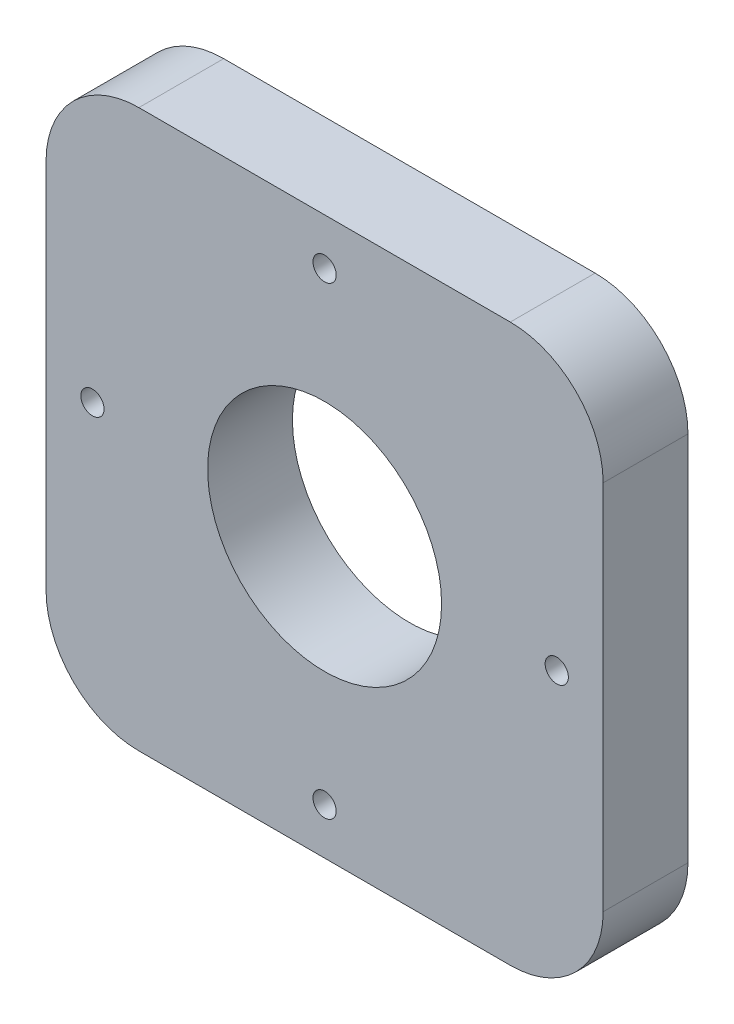
ISO-10303-21;
HEADER;
FILE_DESCRIPTION(('STEP AP214'),'2;1');
FILE_NAME('part.step','',(''),(''),'','','');
FILE_SCHEMA(('AUTOMOTIVE_DESIGN { 1 0 10303 214 1 1 1 1 }'));
ENDSEC;
DATA;
#1=APPLICATION_CONTEXT('core data for automotive mechanical design processes');
#2=APPLICATION_PROTOCOL_DEFINITION('international standard','automotive_design',2000,#1);
#3=PRODUCT_CONTEXT('',#1,'mechanical');
#4=PRODUCT('Part','Part','',(#3));
#5=PRODUCT_RELATED_PRODUCT_CATEGORY('part','',(#4));
#6=PRODUCT_DEFINITION_FORMATION('','',#4);
#7=PRODUCT_DEFINITION_CONTEXT('part definition',#1,'design');
#8=PRODUCT_DEFINITION('design','',#6,#7);
#9=PRODUCT_DEFINITION_SHAPE('','',#8);
#10=(LENGTH_UNIT() NAMED_UNIT(*) SI_UNIT(.MILLI.,.METRE.));
#11=(NAMED_UNIT(*) PLANE_ANGLE_UNIT() SI_UNIT($,.RADIAN.));
#12=(NAMED_UNIT(*) SI_UNIT($,.STERADIAN.) SOLID_ANGLE_UNIT());
#13=UNCERTAINTY_MEASURE_WITH_UNIT(LENGTH_MEASURE(1.E-05),#10,'distance_accuracy_value','');
#14=(GEOMETRIC_REPRESENTATION_CONTEXT(3) GLOBAL_UNCERTAINTY_ASSIGNED_CONTEXT((#13)) GLOBAL_UNIT_ASSIGNED_CONTEXT((#10,
#11,#12)) REPRESENTATION_CONTEXT('',''));
#15=CARTESIAN_POINT('',(0.,0.,0.));
#16=DIRECTION('',(0.,0.,1.));
#17=DIRECTION('',(1.,0.,0.));
#18=AXIS2_PLACEMENT_3D('',#15,#16,#17);
#19=CARTESIAN_POINT('',(19.05,19.05,5.8));
#20=DIRECTION('',(-1.,0.,0.));
#21=DIRECTION('',(0.,0.,1.));
#22=AXIS2_PLACEMENT_3D('',#19,#20,#21);
#23=PLANE('',#22);
#24=DIRECTION('',(0.,1.,0.));
#25=VECTOR('',#24,1.);
#26=CARTESIAN_POINT('',(19.05,19.05,0.));
#27=LINE('',#26,#25);
#28=CARTESIAN_POINT('',(19.05,-12.7,0.));
#29=VERTEX_POINT('',#28);
#30=CARTESIAN_POINT('',(19.05,12.7,0.));
#31=VERTEX_POINT('',#30);
#32=EDGE_CURVE('E125',#29,#31,#27,.T.);
#33=ORIENTED_EDGE('',*,*,#32,.T.);
#34=DIRECTION('',(0.,0.,-1.));
#35=VECTOR('',#34,1.);
#36=CARTESIAN_POINT('',(19.05,12.7,5.8));
#37=LINE('',#36,#35);
#38=CARTESIAN_POINT('',(19.05,12.7,5.8));
#39=VERTEX_POINT('',#38);
#40=EDGE_CURVE('E103',#31,#39,#37,.F.);
#41=ORIENTED_EDGE('',*,*,#40,.T.);
#42=DIRECTION('',(0.,1.,0.));
#43=VECTOR('',#42,1.);
#44=CARTESIAN_POINT('',(19.05,19.05,5.8));
#45=LINE('',#44,#43);
#46=CARTESIAN_POINT('',(19.05,-12.7,5.8));
#47=VERTEX_POINT('',#46);
#48=EDGE_CURVE('E135',#47,#39,#45,.T.);
#49=ORIENTED_EDGE('',*,*,#48,.F.);
#50=DIRECTION('',(0.,0.,-1.));
#51=VECTOR('',#50,1.);
#52=CARTESIAN_POINT('',(19.05,-12.7,5.8));
#53=LINE('',#52,#51);
#54=EDGE_CURVE('E108',#47,#29,#53,.T.);
#55=ORIENTED_EDGE('',*,*,#54,.T.);
#56=EDGE_LOOP('',(#33,#41,#49,#55));
#57=FACE_BOUND('',#56,.T.);
#58=ADVANCED_FACE('F32',(#57),#23,.F.);
#59=CARTESIAN_POINT('',(19.05,19.05,5.8));
#60=DIRECTION('',(0.,-1.,0.));
#61=DIRECTION('',(0.,0.,-1.));
#62=AXIS2_PLACEMENT_3D('',#59,#60,#61);
#63=PLANE('',#62);
#64=DIRECTION('',(-1.,0.,0.));
#65=VECTOR('',#64,1.);
#66=CARTESIAN_POINT('',(19.05,19.05,5.8));
#67=LINE('',#66,#65);
#68=CARTESIAN_POINT('',(12.7,19.05,5.8));
#69=VERTEX_POINT('',#68);
#70=CARTESIAN_POINT('',(-12.7,19.05,5.8));
#71=VERTEX_POINT('',#70);
#72=EDGE_CURVE('E118',#69,#71,#67,.T.);
#73=ORIENTED_EDGE('',*,*,#72,.F.);
#74=DIRECTION('',(0.,0.,-1.));
#75=VECTOR('',#74,1.);
#76=CARTESIAN_POINT('',(12.7,19.05,5.8));
#77=LINE('',#76,#75);
#78=CARTESIAN_POINT('',(12.7,19.05,0.));
#79=VERTEX_POINT('',#78);
#80=EDGE_CURVE('E102',#69,#79,#77,.T.);
#81=ORIENTED_EDGE('',*,*,#80,.T.);
#82=DIRECTION('',(-1.,0.,0.));
#83=VECTOR('',#82,1.);
#84=CARTESIAN_POINT('',(19.05,19.05,0.));
#85=LINE('',#84,#83);
#86=CARTESIAN_POINT('',(-12.7,19.05,0.));
#87=VERTEX_POINT('',#86);
#88=EDGE_CURVE('E115',#79,#87,#85,.T.);
#89=ORIENTED_EDGE('',*,*,#88,.T.);
#90=DIRECTION('',(0.,0.,-1.));
#91=VECTOR('',#90,1.);
#92=CARTESIAN_POINT('',(-12.7,19.05,5.8));
#93=LINE('',#92,#91);
#94=EDGE_CURVE('E120',#87,#71,#93,.F.);
#95=ORIENTED_EDGE('',*,*,#94,.T.);
#96=EDGE_LOOP('',(#73,#81,#89,#95));
#97=FACE_BOUND('',#96,.T.);
#98=ADVANCED_FACE('F114',(#97),#63,.F.);
#99=CARTESIAN_POINT('',(-19.05,19.05,5.8));
#100=DIRECTION('',(1.,0.,0.));
#101=DIRECTION('',(0.,0.,-1.));
#102=AXIS2_PLACEMENT_3D('',#99,#100,#101);
#103=PLANE('',#102);
#104=DIRECTION('',(0.,-1.,0.));
#105=VECTOR('',#104,1.);
#106=CARTESIAN_POINT('',(-19.05,19.05,5.8));
#107=LINE('',#106,#105);
#108=CARTESIAN_POINT('',(-19.05,12.7,5.8));
#109=VERTEX_POINT('',#108);
#110=CARTESIAN_POINT('',(-19.05,-12.7,5.8));
#111=VERTEX_POINT('',#110);
#112=EDGE_CURVE('E166',#109,#111,#107,.T.);
#113=ORIENTED_EDGE('',*,*,#112,.F.);
#114=DIRECTION('',(0.,0.,-1.));
#115=VECTOR('',#114,1.);
#116=CARTESIAN_POINT('',(-19.05,12.7,5.8));
#117=LINE('',#116,#115);
#118=CARTESIAN_POINT('',(-19.05,12.7,0.));
#119=VERTEX_POINT('',#118);
#120=EDGE_CURVE('E159',#109,#119,#117,.T.);
#121=ORIENTED_EDGE('',*,*,#120,.T.);
#122=DIRECTION('',(0.,-1.,0.));
#123=VECTOR('',#122,1.);
#124=CARTESIAN_POINT('',(-19.05,19.05,0.));
#125=LINE('',#124,#123);
#126=CARTESIAN_POINT('',(-19.05,-12.7,0.));
#127=VERTEX_POINT('',#126);
#128=EDGE_CURVE('E124',#119,#127,#125,.T.);
#129=ORIENTED_EDGE('',*,*,#128,.T.);
#130=DIRECTION('',(0.,0.,-1.));
#131=VECTOR('',#130,1.);
#132=CARTESIAN_POINT('',(-19.05,-12.7,5.8));
#133=LINE('',#132,#131);
#134=EDGE_CURVE('E157',#127,#111,#133,.F.);
#135=ORIENTED_EDGE('',*,*,#134,.T.);
#136=EDGE_LOOP('',(#113,#121,#129,#135));
#137=FACE_BOUND('',#136,.T.);
#138=ADVANCED_FACE('F164',(#137),#103,.F.);
#139=CARTESIAN_POINT('',(19.05,-19.05,5.8));
#140=DIRECTION('',(0.,1.,0.));
#141=DIRECTION('',(0.,0.,1.));
#142=AXIS2_PLACEMENT_3D('',#139,#140,#141);
#143=PLANE('',#142);
#144=DIRECTION('',(1.,0.,0.));
#145=VECTOR('',#144,1.);
#146=CARTESIAN_POINT('',(19.05,-19.05,5.8));
#147=LINE('',#146,#145);
#148=CARTESIAN_POINT('',(-12.7,-19.05,5.8));
#149=VERTEX_POINT('',#148);
#150=CARTESIAN_POINT('',(12.7,-19.05,5.8));
#151=VERTEX_POINT('',#150);
#152=EDGE_CURVE('E141',#149,#151,#147,.T.);
#153=ORIENTED_EDGE('',*,*,#152,.F.);
#154=DIRECTION('',(0.,0.,-1.));
#155=VECTOR('',#154,1.);
#156=CARTESIAN_POINT('',(-12.7,-19.05,5.8));
#157=LINE('',#156,#155);
#158=CARTESIAN_POINT('',(-12.7,-19.05,0.));
#159=VERTEX_POINT('',#158);
#160=EDGE_CURVE('E11',#149,#159,#157,.T.);
#161=ORIENTED_EDGE('',*,*,#160,.T.);
#162=DIRECTION('',(1.,0.,0.));
#163=VECTOR('',#162,1.);
#164=CARTESIAN_POINT('',(19.05,-19.05,0.));
#165=LINE('',#164,#163);
#166=CARTESIAN_POINT('',(12.7,-19.05,0.));
#167=VERTEX_POINT('',#166);
#168=EDGE_CURVE('E128',#159,#167,#165,.T.);
#169=ORIENTED_EDGE('',*,*,#168,.T.);
#170=DIRECTION('',(0.,0.,-1.));
#171=VECTOR('',#170,1.);
#172=CARTESIAN_POINT('',(12.7,-19.05,5.8));
#173=LINE('',#172,#171);
#174=EDGE_CURVE('E40',#167,#151,#173,.F.);
#175=ORIENTED_EDGE('',*,*,#174,.T.);
#176=EDGE_LOOP('',(#153,#161,#169,#175));
#177=FACE_BOUND('',#176,.T.);
#178=ADVANCED_FACE('F173',(#177),#143,.F.);
#179=CARTESIAN_POINT('',(19.05,-19.05,5.8));
#180=DIRECTION('',(0.,0.,-1.));
#181=DIRECTION('',(-1.,0.,0.));
#182=AXIS2_PLACEMENT_3D('',#179,#180,#181);
#183=PLANE('',#182);
#184=CARTESIAN_POINT('',(0.,0.,5.8));
#185=DIRECTION('',(0.,0.,1.));
#186=DIRECTION('',(1.,0.,0.));
#187=AXIS2_PLACEMENT_3D('',#184,#185,#186);
#188=CIRCLE('',#187,8.);
#189=CARTESIAN_POINT('',(8.,0.,5.8));
#190=VERTEX_POINT('',#189);
#191=EDGE_CURVE('E140',#190,#190,#188,.T.);
#192=ORIENTED_EDGE('',*,*,#191,.F.);
#193=EDGE_LOOP('',(#192));
#194=FACE_BOUND('',#193,.T.);
#195=CARTESIAN_POINT('',(-15.8749999999998,-2.21709065016539E-13,5.8));
#196=DIRECTION('',(0.,0.,1.));
#197=DIRECTION('',(1.,0.,0.));
#198=AXIS2_PLACEMENT_3D('',#195,#196,#197);
#199=CIRCLE('',#198,0.793749999999999);
#200=CARTESIAN_POINT('',(-15.0812499999998,-2.21709065016539E-13,5.8));
#201=VERTEX_POINT('',#200);
#202=EDGE_CURVE('E139',#201,#201,#199,.T.);
#203=ORIENTED_EDGE('',*,*,#202,.F.);
#204=EDGE_LOOP('',(#203));
#205=FACE_BOUND('',#204,.T.);
#206=CARTESIAN_POINT('',(0.,-15.875,5.8));
#207=DIRECTION('',(0.,0.,1.));
#208=DIRECTION('',(1.,0.,0.));
#209=AXIS2_PLACEMENT_3D('',#206,#207,#208);
#210=CIRCLE('',#209,0.793750000000494);
#211=CARTESIAN_POINT('',(0.79375000000044,-15.875,5.8));
#212=VERTEX_POINT('',#211);
#213=EDGE_CURVE('E192',#212,#212,#210,.T.);
#214=ORIENTED_EDGE('',*,*,#213,.F.);
#215=EDGE_LOOP('',(#214));
#216=FACE_BOUND('',#215,.T.);
#217=CARTESIAN_POINT('',(15.875,0.,5.8));
#218=DIRECTION('',(0.,0.,1.));
#219=DIRECTION('',(1.,0.,0.));
#220=AXIS2_PLACEMENT_3D('',#217,#218,#219);
#221=CIRCLE('',#220,0.793749999999999);
#222=CARTESIAN_POINT('',(16.66875,0.,5.8));
#223=VERTEX_POINT('',#222);
#224=EDGE_CURVE('E186',#223,#223,#221,.T.);
#225=ORIENTED_EDGE('',*,*,#224,.F.);
#226=EDGE_LOOP('',(#225));
#227=FACE_BOUND('',#226,.T.);
#228=CARTESIAN_POINT('',(0.,15.875,5.8));
#229=DIRECTION('',(0.,0.,1.));
#230=DIRECTION('',(1.,0.,0.));
#231=AXIS2_PLACEMENT_3D('',#228,#229,#230);
#232=CIRCLE('',#231,0.79375);
#233=CARTESIAN_POINT('',(0.79375,15.875,5.8));
#234=VERTEX_POINT('',#233);
#235=EDGE_CURVE('E180',#234,#234,#232,.T.);
#236=ORIENTED_EDGE('',*,*,#235,.F.);
#237=EDGE_LOOP('',(#236));
#238=FACE_BOUND('',#237,.T.);
#239=ORIENTED_EDGE('',*,*,#48,.T.);
#240=CARTESIAN_POINT('',(12.7,12.7,5.8));
#241=DIRECTION('',(0.,0.,-1.));
#242=DIRECTION('',(-1.,0.,0.));
#243=AXIS2_PLACEMENT_3D('',#240,#241,#242);
#244=CIRCLE('',#243,6.35);
#245=EDGE_CURVE('E155',#39,#69,#244,.F.);
#246=ORIENTED_EDGE('',*,*,#245,.T.);
#247=ORIENTED_EDGE('',*,*,#72,.T.);
#248=CARTESIAN_POINT('',(-12.7,12.7,5.8));
#249=DIRECTION('',(0.,0.,-1.));
#250=DIRECTION('',(-1.,0.,0.));
#251=AXIS2_PLACEMENT_3D('',#248,#249,#250);
#252=CIRCLE('',#251,6.35);
#253=EDGE_CURVE('E153',#71,#109,#252,.F.);
#254=ORIENTED_EDGE('',*,*,#253,.T.);
#255=ORIENTED_EDGE('',*,*,#112,.T.);
#256=CARTESIAN_POINT('',(-12.7,-12.7,5.8));
#257=DIRECTION('',(0.,0.,-1.));
#258=DIRECTION('',(-1.,0.,0.));
#259=AXIS2_PLACEMENT_3D('',#256,#257,#258);
#260=CIRCLE('',#259,6.35);
#261=EDGE_CURVE('E53',#111,#149,#260,.F.);
#262=ORIENTED_EDGE('',*,*,#261,.T.);
#263=ORIENTED_EDGE('',*,*,#152,.T.);
#264=CARTESIAN_POINT('',(12.7,-12.7,5.8));
#265=DIRECTION('',(0.,0.,-1.));
#266=DIRECTION('',(-1.,0.,0.));
#267=AXIS2_PLACEMENT_3D('',#264,#265,#266);
#268=CIRCLE('',#267,6.35);
#269=EDGE_CURVE('E150',#151,#47,#268,.F.);
#270=ORIENTED_EDGE('',*,*,#269,.T.);
#271=EDGE_LOOP('',(#239,#246,#247,#254,#255,#262,#263,#270));
#272=FACE_BOUND('',#271,.T.);
#273=ADVANCED_FACE('F207',(#194,#205,#216,#227,#238,#272),#183,.F.);
#274=CARTESIAN_POINT('',(19.05,-19.05,0.));
#275=DIRECTION('',(0.,0.,-1.));
#276=DIRECTION('',(-1.,0.,0.));
#277=AXIS2_PLACEMENT_3D('',#274,#275,#276);
#278=PLANE('',#277);
#279=CARTESIAN_POINT('',(0.,0.,0.));
#280=DIRECTION('',(0.,0.,-1.));
#281=DIRECTION('',(-1.,0.,0.));
#282=AXIS2_PLACEMENT_3D('',#279,#280,#281);
#283=CIRCLE('',#282,8.);
#284=CARTESIAN_POINT('',(-8.,0.,0.));
#285=VERTEX_POINT('',#284);
#286=EDGE_CURVE('E136',#285,#285,#283,.T.);
#287=ORIENTED_EDGE('',*,*,#286,.F.);
#288=EDGE_LOOP('',(#287));
#289=FACE_BOUND('',#288,.T.);
#290=CARTESIAN_POINT('',(-15.8749999999998,-2.21709065016539E-13,0.));
#291=DIRECTION('',(0.,0.,1.));
#292=DIRECTION('',(1.,0.,0.));
#293=AXIS2_PLACEMENT_3D('',#290,#291,#292);
#294=CIRCLE('',#293,0.793749999999999);
#295=CARTESIAN_POINT('',(-15.0812499999998,-2.21709065016539E-13,0.));
#296=VERTEX_POINT('',#295);
#297=EDGE_CURVE('E195',#296,#296,#294,.T.);
#298=ORIENTED_EDGE('',*,*,#297,.T.);
#299=EDGE_LOOP('',(#298));
#300=FACE_BOUND('',#299,.T.);
#301=CARTESIAN_POINT('',(0.,-15.875,0.));
#302=DIRECTION('',(0.,0.,1.));
#303=DIRECTION('',(1.,0.,0.));
#304=AXIS2_PLACEMENT_3D('',#301,#302,#303);
#305=CIRCLE('',#304,0.793750000000494);
#306=CARTESIAN_POINT('',(0.79375000000044,-15.875,0.));
#307=VERTEX_POINT('',#306);
#308=EDGE_CURVE('E189',#307,#307,#305,.T.);
#309=ORIENTED_EDGE('',*,*,#308,.T.);
#310=EDGE_LOOP('',(#309));
#311=FACE_BOUND('',#310,.T.);
#312=CARTESIAN_POINT('',(15.875,0.,0.));
#313=DIRECTION('',(0.,0.,1.));
#314=DIRECTION('',(1.,0.,0.));
#315=AXIS2_PLACEMENT_3D('',#312,#313,#314);
#316=CIRCLE('',#315,0.793749999999999);
#317=CARTESIAN_POINT('',(16.66875,0.,0.));
#318=VERTEX_POINT('',#317);
#319=EDGE_CURVE('E183',#318,#318,#316,.T.);
#320=ORIENTED_EDGE('',*,*,#319,.T.);
#321=EDGE_LOOP('',(#320));
#322=FACE_BOUND('',#321,.T.);
#323=CARTESIAN_POINT('',(0.,15.875,0.));
#324=DIRECTION('',(0.,0.,1.));
#325=DIRECTION('',(1.,0.,0.));
#326=AXIS2_PLACEMENT_3D('',#323,#324,#325);
#327=CIRCLE('',#326,0.79375);
#328=CARTESIAN_POINT('',(0.79375,15.875,0.));
#329=VERTEX_POINT('',#328);
#330=EDGE_CURVE('E130',#329,#329,#327,.T.);
#331=ORIENTED_EDGE('',*,*,#330,.T.);
#332=EDGE_LOOP('',(#331));
#333=FACE_BOUND('',#332,.T.);
#334=ORIENTED_EDGE('',*,*,#88,.F.);
#335=CARTESIAN_POINT('',(12.7,12.7,0.));
#336=DIRECTION('',(0.,0.,-1.));
#337=DIRECTION('',(-1.,0.,0.));
#338=AXIS2_PLACEMENT_3D('',#335,#336,#337);
#339=CIRCLE('',#338,6.35);
#340=EDGE_CURVE('E98',#79,#31,#339,.T.);
#341=ORIENTED_EDGE('',*,*,#340,.T.);
#342=ORIENTED_EDGE('',*,*,#32,.F.);
#343=CARTESIAN_POINT('',(12.7,-12.7,0.));
#344=DIRECTION('',(0.,0.,-1.));
#345=DIRECTION('',(-1.,0.,0.));
#346=AXIS2_PLACEMENT_3D('',#343,#344,#345);
#347=CIRCLE('',#346,6.35);
#348=EDGE_CURVE('E119',#29,#167,#347,.T.);
#349=ORIENTED_EDGE('',*,*,#348,.T.);
#350=ORIENTED_EDGE('',*,*,#168,.F.);
#351=CARTESIAN_POINT('',(-12.7,-12.7,0.));
#352=DIRECTION('',(0.,0.,-1.));
#353=DIRECTION('',(-1.,0.,0.));
#354=AXIS2_PLACEMENT_3D('',#351,#352,#353);
#355=CIRCLE('',#354,6.35);
#356=EDGE_CURVE('E144',#159,#127,#355,.T.);
#357=ORIENTED_EDGE('',*,*,#356,.T.);
#358=ORIENTED_EDGE('',*,*,#128,.F.);
#359=CARTESIAN_POINT('',(-12.7,12.7,0.));
#360=DIRECTION('',(0.,0.,-1.));
#361=DIRECTION('',(-1.,0.,0.));
#362=AXIS2_PLACEMENT_3D('',#359,#360,#361);
#363=CIRCLE('',#362,6.35);
#364=EDGE_CURVE('E109',#119,#87,#363,.T.);
#365=ORIENTED_EDGE('',*,*,#364,.T.);
#366=EDGE_LOOP('',(#334,#341,#342,#349,#350,#357,#358,#365));
#367=FACE_BOUND('',#366,.T.);
#368=ADVANCED_FACE('F122',(#289,#300,#311,#322,#333,#367),#278,.T.);
#369=CARTESIAN_POINT('',(0.,15.875,0.));
#370=DIRECTION('',(0.,0.,1.));
#371=DIRECTION('',(1.,0.,0.));
#372=AXIS2_PLACEMENT_3D('',#369,#370,#371);
#373=CYLINDRICAL_SURFACE('',#372,0.79375);
#374=ORIENTED_EDGE('',*,*,#330,.F.);
#375=EDGE_LOOP('',(#374));
#376=FACE_BOUND('',#375,.T.);
#377=ORIENTED_EDGE('',*,*,#235,.T.);
#378=EDGE_LOOP('',(#377));
#379=FACE_BOUND('',#378,.T.);
#380=ADVANCED_FACE('F294',(#376,#379),#373,.F.);
#381=CARTESIAN_POINT('',(15.875,0.,0.));
#382=DIRECTION('',(0.,0.,1.));
#383=DIRECTION('',(1.,0.,0.));
#384=AXIS2_PLACEMENT_3D('',#381,#382,#383);
#385=CYLINDRICAL_SURFACE('',#384,0.793749999999999);
#386=ORIENTED_EDGE('',*,*,#319,.F.);
#387=EDGE_LOOP('',(#386));
#388=FACE_BOUND('',#387,.T.);
#389=ORIENTED_EDGE('',*,*,#224,.T.);
#390=EDGE_LOOP('',(#389));
#391=FACE_BOUND('',#390,.T.);
#392=ADVANCED_FACE('F285',(#388,#391),#385,.F.);
#393=CARTESIAN_POINT('',(0.,-15.875,0.));
#394=DIRECTION('',(0.,0.,1.));
#395=DIRECTION('',(1.,0.,0.));
#396=AXIS2_PLACEMENT_3D('',#393,#394,#395);
#397=CYLINDRICAL_SURFACE('',#396,0.793750000000494);
#398=ORIENTED_EDGE('',*,*,#308,.F.);
#399=EDGE_LOOP('',(#398));
#400=FACE_BOUND('',#399,.T.);
#401=ORIENTED_EDGE('',*,*,#213,.T.);
#402=EDGE_LOOP('',(#401));
#403=FACE_BOUND('',#402,.T.);
#404=ADVANCED_FACE('F276',(#400,#403),#397,.F.);
#405=CARTESIAN_POINT('',(-15.8749999999998,-2.21709065016539E-13,0.));
#406=DIRECTION('',(0.,0.,1.));
#407=DIRECTION('',(1.,0.,0.));
#408=AXIS2_PLACEMENT_3D('',#405,#406,#407);
#409=CYLINDRICAL_SURFACE('',#408,0.793749999999999);
#410=ORIENTED_EDGE('',*,*,#297,.F.);
#411=EDGE_LOOP('',(#410));
#412=FACE_BOUND('',#411,.T.);
#413=ORIENTED_EDGE('',*,*,#202,.T.);
#414=EDGE_LOOP('',(#413));
#415=FACE_BOUND('',#414,.T.);
#416=ADVANCED_FACE('F267',(#412,#415),#409,.F.);
#417=CARTESIAN_POINT('',(0.,0.,-6.9));
#418=DIRECTION('',(0.,0.,1.));
#419=DIRECTION('',(1.,0.,0.));
#420=AXIS2_PLACEMENT_3D('',#417,#418,#419);
#421=CYLINDRICAL_SURFACE('',#420,8.);
#422=ORIENTED_EDGE('',*,*,#286,.T.);
#423=EDGE_LOOP('',(#422));
#424=FACE_BOUND('',#423,.T.);
#425=ORIENTED_EDGE('',*,*,#191,.T.);
#426=EDGE_LOOP('',(#425));
#427=FACE_BOUND('',#426,.T.);
#428=ADVANCED_FACE('F205',(#424,#427),#421,.F.);
#429=CARTESIAN_POINT('',(12.7,12.7,5.8));
#430=DIRECTION('',(0.,0.,-1.));
#431=DIRECTION('',(-1.,0.,0.));
#432=AXIS2_PLACEMENT_3D('',#429,#430,#431);
#433=CYLINDRICAL_SURFACE('',#432,6.35);
#434=ORIENTED_EDGE('',*,*,#245,.F.);
#435=ORIENTED_EDGE('',*,*,#40,.F.);
#436=ORIENTED_EDGE('',*,*,#340,.F.);
#437=ORIENTED_EDGE('',*,*,#80,.F.);
#438=EDGE_LOOP('',(#434,#435,#436,#437));
#439=FACE_BOUND('',#438,.T.);
#440=ADVANCED_FACE('F101',(#439),#433,.T.);
#441=CARTESIAN_POINT('',(-12.7,12.7,5.8));
#442=DIRECTION('',(0.,0.,-1.));
#443=DIRECTION('',(-1.,0.,0.));
#444=AXIS2_PLACEMENT_3D('',#441,#442,#443);
#445=CYLINDRICAL_SURFACE('',#444,6.35);
#446=ORIENTED_EDGE('',*,*,#253,.F.);
#447=ORIENTED_EDGE('',*,*,#94,.F.);
#448=ORIENTED_EDGE('',*,*,#364,.F.);
#449=ORIENTED_EDGE('',*,*,#120,.F.);
#450=EDGE_LOOP('',(#446,#447,#448,#449));
#451=FACE_BOUND('',#450,.T.);
#452=ADVANCED_FACE('F226',(#451),#445,.T.);
#453=CARTESIAN_POINT('',(-12.7,-12.7,5.8));
#454=DIRECTION('',(0.,0.,-1.));
#455=DIRECTION('',(-1.,0.,0.));
#456=AXIS2_PLACEMENT_3D('',#453,#454,#455);
#457=CYLINDRICAL_SURFACE('',#456,6.35);
#458=ORIENTED_EDGE('',*,*,#261,.F.);
#459=ORIENTED_EDGE('',*,*,#134,.F.);
#460=ORIENTED_EDGE('',*,*,#356,.F.);
#461=ORIENTED_EDGE('',*,*,#160,.F.);
#462=EDGE_LOOP('',(#458,#459,#460,#461));
#463=FACE_BOUND('',#462,.T.);
#464=ADVANCED_FACE('F172',(#463),#457,.T.);
#465=CARTESIAN_POINT('',(12.7,-12.7,5.8));
#466=DIRECTION('',(0.,0.,-1.));
#467=DIRECTION('',(-1.,0.,0.));
#468=AXIS2_PLACEMENT_3D('',#465,#466,#467);
#469=CYLINDRICAL_SURFACE('',#468,6.35);
#470=ORIENTED_EDGE('',*,*,#269,.F.);
#471=ORIENTED_EDGE('',*,*,#174,.F.);
#472=ORIENTED_EDGE('',*,*,#348,.F.);
#473=ORIENTED_EDGE('',*,*,#54,.F.);
#474=EDGE_LOOP('',(#470,#471,#472,#473));
#475=FACE_BOUND('',#474,.T.);
#476=ADVANCED_FACE('F34',(#475),#469,.T.);
#477=CLOSED_SHELL('',(#58,#98,#138,#178,#273,#368,#380,#392,#404,#416,#428,#440,#452,#464,#476));
#478=MANIFOLD_SOLID_BREP('B2',#477);
#479=ADVANCED_BREP_SHAPE_REPRESENTATION('',(#18,#478),#14);
#480=SHAPE_DEFINITION_REPRESENTATION(#9,#479);
ENDSEC;
END-ISO-10303-21;
